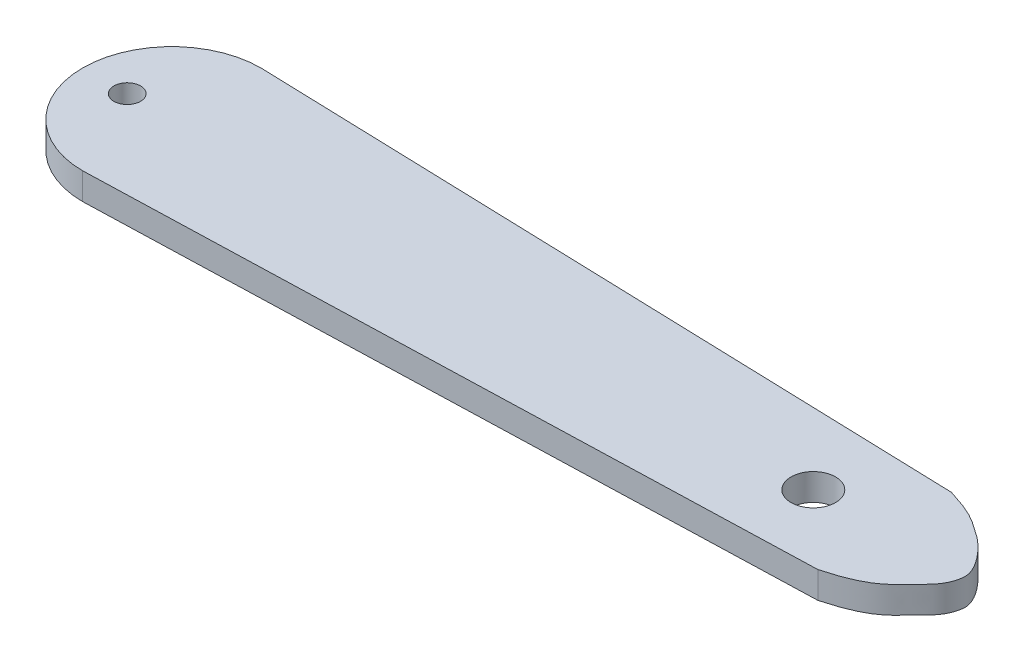
ISO-10303-21;
HEADER;
FILE_DESCRIPTION(('STEP AP214'),'2;1');
FILE_NAME('part.step','',(''),(''),'','','');
FILE_SCHEMA(('AUTOMOTIVE_DESIGN { 1 0 10303 214 1 1 1 1 }'));
ENDSEC;
DATA;
#1=APPLICATION_CONTEXT('core data for automotive mechanical design processes');
#2=APPLICATION_PROTOCOL_DEFINITION('international standard','automotive_design',2000,#1);
#3=PRODUCT_CONTEXT('',#1,'mechanical');
#4=PRODUCT('Part','Part','',(#3));
#5=PRODUCT_RELATED_PRODUCT_CATEGORY('part','',(#4));
#6=PRODUCT_DEFINITION_FORMATION('','',#4);
#7=PRODUCT_DEFINITION_CONTEXT('part definition',#1,'design');
#8=PRODUCT_DEFINITION('design','',#6,#7);
#9=PRODUCT_DEFINITION_SHAPE('','',#8);
#10=(LENGTH_UNIT() NAMED_UNIT(*) SI_UNIT(.MILLI.,.METRE.));
#11=(NAMED_UNIT(*) PLANE_ANGLE_UNIT() SI_UNIT($,.RADIAN.));
#12=(NAMED_UNIT(*) SI_UNIT($,.STERADIAN.) SOLID_ANGLE_UNIT());
#13=UNCERTAINTY_MEASURE_WITH_UNIT(LENGTH_MEASURE(1.E-05),#10,'distance_accuracy_value','');
#14=(GEOMETRIC_REPRESENTATION_CONTEXT(3) GLOBAL_UNCERTAINTY_ASSIGNED_CONTEXT((#13)) GLOBAL_UNIT_ASSIGNED_CONTEXT((#10,
#11,#12)) REPRESENTATION_CONTEXT('',''));
#15=CARTESIAN_POINT('',(0.,0.,0.));
#16=DIRECTION('',(0.,0.,1.));
#17=DIRECTION('',(1.,0.,0.));
#18=AXIS2_PLACEMENT_3D('',#15,#16,#17);
#19=CARTESIAN_POINT('',(-50.,3.,0.));
#20=DIRECTION('',(0.,-1.,0.));
#21=DIRECTION('',(0.,0.,-1.));
#22=AXIS2_PLACEMENT_3D('',#19,#20,#21);
#23=CYLINDRICAL_SURFACE('',#22,10.);
#24=CARTESIAN_POINT('',(-50.,0.,0.));
#25=DIRECTION('',(0.,1.,0.));
#26=DIRECTION('',(0.,0.,-1.));
#27=AXIS2_PLACEMENT_3D('',#24,#25,#26);
#28=CIRCLE('',#27,10.);
#29=CARTESIAN_POINT('',(-50.,0.,-10.));
#30=VERTEX_POINT('',#29);
#31=CARTESIAN_POINT('',(-50.,0.,10.));
#32=VERTEX_POINT('',#31);
#33=EDGE_CURVE('E122',#30,#32,#28,.T.);
#34=ORIENTED_EDGE('',*,*,#33,.T.);
#35=DIRECTION('',(0.,-1.,0.));
#36=VECTOR('',#35,1.);
#37=CARTESIAN_POINT('',(-50.,3.,10.));
#38=LINE('',#37,#36);
#39=CARTESIAN_POINT('',(-50.,3.,10.));
#40=VERTEX_POINT('',#39);
#41=EDGE_CURVE('E11',#40,#32,#38,.T.);
#42=ORIENTED_EDGE('',*,*,#41,.F.);
#43=CARTESIAN_POINT('',(-50.,3.,0.));
#44=DIRECTION('',(0.,1.,0.));
#45=DIRECTION('',(0.,0.,-1.));
#46=AXIS2_PLACEMENT_3D('',#43,#44,#45);
#47=CIRCLE('',#46,10.);
#48=CARTESIAN_POINT('',(-50.,3.,-10.));
#49=VERTEX_POINT('',#48);
#50=EDGE_CURVE('E89',#49,#40,#47,.T.);
#51=ORIENTED_EDGE('',*,*,#50,.F.);
#52=DIRECTION('',(0.,-1.,0.));
#53=VECTOR('',#52,1.);
#54=CARTESIAN_POINT('',(-50.,3.,-10.));
#55=LINE('',#54,#53);
#56=EDGE_CURVE('E98',#49,#30,#55,.T.);
#57=ORIENTED_EDGE('',*,*,#56,.T.);
#58=EDGE_LOOP('',(#34,#42,#51,#57));
#59=FACE_BOUND('',#58,.T.);
#60=ADVANCED_FACE('F36',(#59),#23,.T.);
#61=CARTESIAN_POINT('',(-50.,3.,10.));
#62=DIRECTION('',(-0.0312347523777212,0.,-0.999512076087079));
#63=DIRECTION('',(-0.999512076087079,0.,0.0312347523777212));
#64=AXIS2_PLACEMENT_3D('',#61,#62,#63);
#65=PLANE('',#64);
#66=DIRECTION('',(0.999512076087079,0.,-0.0312347523777212));
#67=VECTOR('',#66,1.);
#68=CARTESIAN_POINT('',(-50.,0.,10.));
#69=LINE('',#68,#67);
#70=CARTESIAN_POINT('',(30.,0.,7.5));
#71=VERTEX_POINT('',#70);
#72=EDGE_CURVE('E93',#32,#71,#69,.T.);
#73=ORIENTED_EDGE('',*,*,#72,.T.);
#74=DIRECTION('',(0.,-1.,0.));
#75=VECTOR('',#74,1.);
#76=CARTESIAN_POINT('',(30.,3.,7.5));
#77=LINE('',#76,#75);
#78=CARTESIAN_POINT('',(30.,3.,7.5));
#79=VERTEX_POINT('',#78);
#80=EDGE_CURVE('E45',#79,#71,#77,.T.);
#81=ORIENTED_EDGE('',*,*,#80,.F.);
#82=DIRECTION('',(0.999512076087079,0.,-0.0312347523777212));
#83=VECTOR('',#82,1.);
#84=CARTESIAN_POINT('',(-50.,3.,10.));
#85=LINE('',#84,#83);
#86=EDGE_CURVE('E84',#40,#79,#85,.T.);
#87=ORIENTED_EDGE('',*,*,#86,.F.);
#88=ORIENTED_EDGE('',*,*,#41,.T.);
#89=EDGE_LOOP('',(#73,#81,#87,#88));
#90=FACE_BOUND('',#89,.T.);
#91=ADVANCED_FACE('F92',(#90),#65,.F.);
#92=CARTESIAN_POINT('',(29.9999999999996,3.,7.5000000000001));
#93=CARTESIAN_POINT('',(33.4325491905637,3.,6.5906355053556));
#94=CARTESIAN_POINT('',(35.347677144862,3.,5.10879059295448));
#95=CARTESIAN_POINT('',(37.3901864833686,3.,2.92457218244511));
#96=CARTESIAN_POINT('',(38.6753158740849,3.,1.97563952589618));
#97=CARTESIAN_POINT('',(39.1609283633187,3.,-1.18621680551419));
#98=CARTESIAN_POINT('',(36.6622465930954,3.,-4.01334904885719));
#99=CARTESIAN_POINT('',(33.8444832164958,3.,-5.88838767652442));
#100=CARTESIAN_POINT('',(33.2617168583019,3.,-6.48149662452451));
#101=CARTESIAN_POINT('',(30.,3.,-7.5));
#102=B_SPLINE_CURVE_WITH_KNOTS('',3,(#92,#93,#94,#95,#96,#97,#98,#99,#100,#101),.UNSPECIFIED.,
.F.,.F.,(4,1,1,1,1,1,1,4),(0.,0.0901269462792187,0.133821357728251,0.403263808183424,
0.459490199162071,0.639858876536069,0.696164465087037,1.),.UNSPECIFIED.);
#103=DIRECTION('',(0.,-1.,0.));
#104=VECTOR('',#103,1.);
#105=SURFACE_OF_LINEAR_EXTRUSION('',#102,#104);
#106=CARTESIAN_POINT('',(29.9999999999996,0.,7.5000000000001));
#107=CARTESIAN_POINT('',(33.4325491905637,0.,6.5906355053556));
#108=CARTESIAN_POINT('',(35.347677144862,0.,5.10879059295448));
#109=CARTESIAN_POINT('',(37.3901864833686,0.,2.92457218244511));
#110=CARTESIAN_POINT('',(38.6753158740849,0.,1.97563952589618));
#111=CARTESIAN_POINT('',(39.1609283633187,0.,-1.18621680551419));
#112=CARTESIAN_POINT('',(36.6622465930954,0.,-4.01334904885719));
#113=CARTESIAN_POINT('',(33.8444832164958,0.,-5.88838767652442));
#114=CARTESIAN_POINT('',(33.2617168583019,0.,-6.48149662452451));
#115=CARTESIAN_POINT('',(30.,0.,-7.5));
#116=B_SPLINE_CURVE_WITH_KNOTS('',3,(#106,#107,#108,#109,#110,#111,#112,#113,#114,#115),
.UNSPECIFIED.,.F.,.F.,(4,1,1,1,1,1,1,4),(0.,0.0901269462792187,0.133821357728251,
0.403263808183424,0.459490199162071,0.639858876536069,0.696164465087037,1.),.UNSPECIFIED.);
#117=CARTESIAN_POINT('',(30.,0.,-7.5));
#118=VERTEX_POINT('',#117);
#119=EDGE_CURVE('E71',#71,#118,#116,.T.);
#120=ORIENTED_EDGE('',*,*,#119,.T.);
#121=DIRECTION('',(0.,-1.,0.));
#122=VECTOR('',#121,1.);
#123=CARTESIAN_POINT('',(30.,3.,-7.5));
#124=LINE('',#123,#122);
#125=CARTESIAN_POINT('',(30.,3.,-7.5));
#126=VERTEX_POINT('',#125);
#127=EDGE_CURVE('E94',#126,#118,#124,.T.);
#128=ORIENTED_EDGE('',*,*,#127,.F.);
#129=EDGE_CURVE('E87',#79,#126,#102,.T.);
#130=ORIENTED_EDGE('',*,*,#129,.F.);
#131=ORIENTED_EDGE('',*,*,#80,.T.);
#132=EDGE_LOOP('',(#120,#128,#130,#131));
#133=FACE_BOUND('',#132,.T.);
#134=ADVANCED_FACE('F96',(#133),#105,.F.);
#135=CARTESIAN_POINT('',(-50.,3.,-10.));
#136=DIRECTION('',(-0.0312347523777212,0.,0.999512076087079));
#137=DIRECTION('',(0.999512076087079,0.,0.0312347523777212));
#138=AXIS2_PLACEMENT_3D('',#135,#136,#137);
#139=PLANE('',#138);
#140=DIRECTION('',(-0.999512076087079,0.,-0.0312347523777212));
#141=VECTOR('',#140,1.);
#142=CARTESIAN_POINT('',(-50.,0.,-10.));
#143=LINE('',#142,#141);
#144=EDGE_CURVE('E77',#118,#30,#143,.T.);
#145=ORIENTED_EDGE('',*,*,#144,.T.);
#146=ORIENTED_EDGE('',*,*,#56,.F.);
#147=DIRECTION('',(-0.999512076087079,0.,-0.0312347523777212));
#148=VECTOR('',#147,1.);
#149=CARTESIAN_POINT('',(-50.,3.,-10.));
#150=LINE('',#149,#148);
#151=EDGE_CURVE('E54',#126,#49,#150,.T.);
#152=ORIENTED_EDGE('',*,*,#151,.F.);
#153=ORIENTED_EDGE('',*,*,#127,.T.);
#154=EDGE_LOOP('',(#145,#146,#152,#153));
#155=FACE_BOUND('',#154,.T.);
#156=ADVANCED_FACE('F111',(#155),#139,.F.);
#157=CARTESIAN_POINT('',(-50.,3.,0.));
#158=DIRECTION('',(0.,-1.,0.));
#159=DIRECTION('',(0.,0.,-1.));
#160=AXIS2_PLACEMENT_3D('',#157,#158,#159);
#161=PLANE('',#160);
#162=CARTESIAN_POINT('',(22.,3.,0.));
#163=DIRECTION('',(0.,1.,0.));
#164=DIRECTION('',(0.,0.,1.));
#165=AXIS2_PLACEMENT_3D('',#162,#163,#164);
#166=CIRCLE('',#165,2.5);
#167=CARTESIAN_POINT('',(22.,3.,2.5));
#168=VERTEX_POINT('',#167);
#169=EDGE_CURVE('E137',#168,#168,#166,.T.);
#170=ORIENTED_EDGE('',*,*,#169,.F.);
#171=EDGE_LOOP('',(#170));
#172=FACE_BOUND('',#171,.T.);
#173=CARTESIAN_POINT('',(-55.,3.,0.));
#174=DIRECTION('',(0.,1.,0.));
#175=DIRECTION('',(0.,0.,1.));
#176=AXIS2_PLACEMENT_3D('',#173,#174,#175);
#177=CIRCLE('',#176,1.5);
#178=CARTESIAN_POINT('',(-55.,3.,1.5));
#179=VERTEX_POINT('',#178);
#180=EDGE_CURVE('E141',#179,#179,#177,.T.);
#181=ORIENTED_EDGE('',*,*,#180,.F.);
#182=EDGE_LOOP('',(#181));
#183=FACE_BOUND('',#182,.T.);
#184=ORIENTED_EDGE('',*,*,#50,.T.);
#185=ORIENTED_EDGE('',*,*,#86,.T.);
#186=ORIENTED_EDGE('',*,*,#129,.T.);
#187=ORIENTED_EDGE('',*,*,#151,.T.);
#188=EDGE_LOOP('',(#184,#185,#186,#187));
#189=FACE_BOUND('',#188,.T.);
#190=ADVANCED_FACE('F85',(#172,#183,#189),#161,.F.);
#191=CARTESIAN_POINT('',(-50.,0.,0.));
#192=DIRECTION('',(0.,-1.,0.));
#193=DIRECTION('',(0.,0.,-1.));
#194=AXIS2_PLACEMENT_3D('',#191,#192,#193);
#195=PLANE('',#194);
#196=CARTESIAN_POINT('',(22.,0.,0.));
#197=DIRECTION('',(0.,-1.,0.));
#198=DIRECTION('',(0.,0.,-1.));
#199=AXIS2_PLACEMENT_3D('',#196,#197,#198);
#200=CIRCLE('',#199,2.5);
#201=CARTESIAN_POINT('',(22.,0.,-2.5));
#202=VERTEX_POINT('',#201);
#203=EDGE_CURVE('E39',#202,#202,#200,.T.);
#204=ORIENTED_EDGE('',*,*,#203,.F.);
#205=EDGE_LOOP('',(#204));
#206=FACE_BOUND('',#205,.T.);
#207=CARTESIAN_POINT('',(-55.,0.,0.));
#208=DIRECTION('',(0.,-1.,0.));
#209=DIRECTION('',(0.,0.,-1.));
#210=AXIS2_PLACEMENT_3D('',#207,#208,#209);
#211=CIRCLE('',#210,1.5);
#212=CARTESIAN_POINT('',(-55.,0.,-1.5));
#213=VERTEX_POINT('',#212);
#214=EDGE_CURVE('E126',#213,#213,#211,.T.);
#215=ORIENTED_EDGE('',*,*,#214,.F.);
#216=EDGE_LOOP('',(#215));
#217=FACE_BOUND('',#216,.T.);
#218=ORIENTED_EDGE('',*,*,#33,.F.);
#219=ORIENTED_EDGE('',*,*,#144,.F.);
#220=ORIENTED_EDGE('',*,*,#119,.F.);
#221=ORIENTED_EDGE('',*,*,#72,.F.);
#222=EDGE_LOOP('',(#218,#219,#220,#221));
#223=FACE_BOUND('',#222,.T.);
#224=ADVANCED_FACE('F152',(#206,#217,#223),#195,.T.);
#225=CARTESIAN_POINT('',(-55.,-1.,0.));
#226=DIRECTION('',(0.,1.,0.));
#227=DIRECTION('',(0.,0.,1.));
#228=AXIS2_PLACEMENT_3D('',#225,#226,#227);
#229=CYLINDRICAL_SURFACE('',#228,1.5);
#230=ORIENTED_EDGE('',*,*,#214,.T.);
#231=EDGE_LOOP('',(#230));
#232=FACE_BOUND('',#231,.T.);
#233=ORIENTED_EDGE('',*,*,#180,.T.);
#234=EDGE_LOOP('',(#233));
#235=FACE_BOUND('',#234,.T.);
#236=ADVANCED_FACE('F149',(#232,#235),#229,.F.);
#237=CARTESIAN_POINT('',(22.,-1.,0.));
#238=DIRECTION('',(0.,1.,0.));
#239=DIRECTION('',(0.,0.,1.));
#240=AXIS2_PLACEMENT_3D('',#237,#238,#239);
#241=CYLINDRICAL_SURFACE('',#240,2.5);
#242=ORIENTED_EDGE('',*,*,#203,.T.);
#243=EDGE_LOOP('',(#242));
#244=FACE_BOUND('',#243,.T.);
#245=ORIENTED_EDGE('',*,*,#169,.T.);
#246=EDGE_LOOP('',(#245));
#247=FACE_BOUND('',#246,.T.);
#248=ADVANCED_FACE('F163',(#244,#247),#241,.F.);
#249=CLOSED_SHELL('',(#60,#91,#134,#156,#190,#224,#236,#248));
#250=MANIFOLD_SOLID_BREP('B2',#249);
#251=ADVANCED_BREP_SHAPE_REPRESENTATION('',(#18,#250),#14);
#252=SHAPE_DEFINITION_REPRESENTATION(#9,#251);
ENDSEC;
END-ISO-10303-21;
